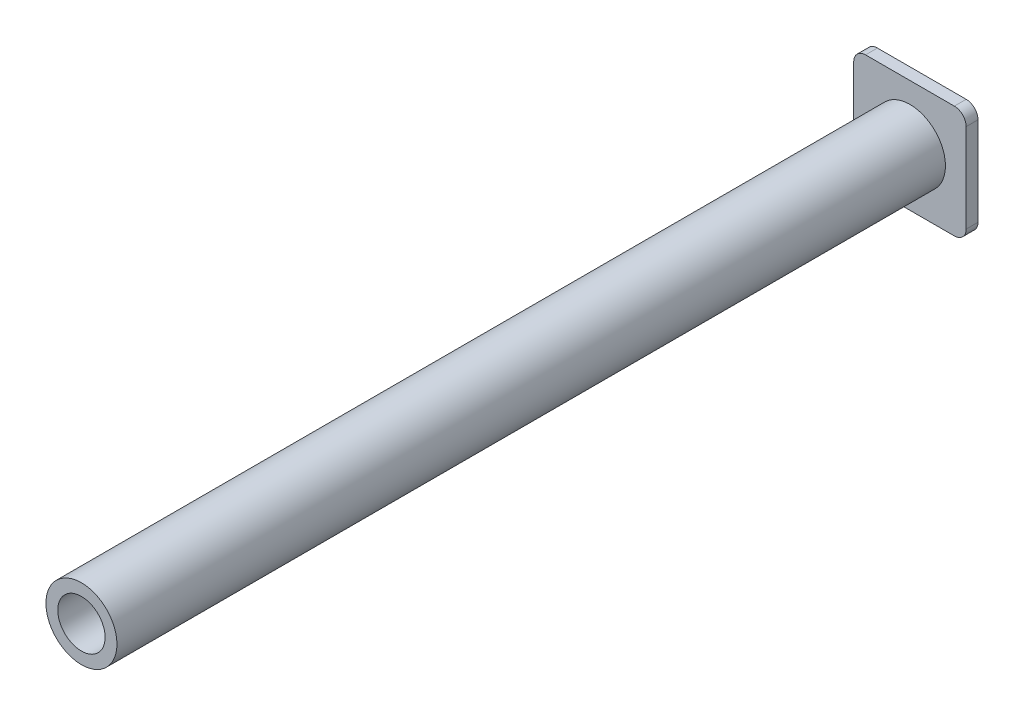
ISO-10303-21;
HEADER;
FILE_DESCRIPTION(('STEP AP214'),'2;1');
FILE_NAME('part.step','',(''),(''),'','','');
FILE_SCHEMA(('AUTOMOTIVE_DESIGN { 1 0 10303 214 1 1 1 1 }'));
ENDSEC;
DATA;
#1=APPLICATION_CONTEXT('core data for automotive mechanical design processes');
#2=APPLICATION_PROTOCOL_DEFINITION('international standard','automotive_design',2000,#1);
#3=PRODUCT_CONTEXT('',#1,'mechanical');
#4=PRODUCT('Part','Part','',(#3));
#5=PRODUCT_RELATED_PRODUCT_CATEGORY('part','',(#4));
#6=PRODUCT_DEFINITION_FORMATION('','',#4);
#7=PRODUCT_DEFINITION_CONTEXT('part definition',#1,'design');
#8=PRODUCT_DEFINITION('design','',#6,#7);
#9=PRODUCT_DEFINITION_SHAPE('','',#8);
#10=(LENGTH_UNIT() NAMED_UNIT(*) SI_UNIT(.MILLI.,.METRE.));
#11=(NAMED_UNIT(*) PLANE_ANGLE_UNIT() SI_UNIT($,.RADIAN.));
#12=(NAMED_UNIT(*) SI_UNIT($,.STERADIAN.) SOLID_ANGLE_UNIT());
#13=UNCERTAINTY_MEASURE_WITH_UNIT(LENGTH_MEASURE(1.E-05),#10,'distance_accuracy_value','');
#14=(GEOMETRIC_REPRESENTATION_CONTEXT(3) GLOBAL_UNCERTAINTY_ASSIGNED_CONTEXT((#13)) GLOBAL_UNIT_ASSIGNED_CONTEXT((#10,
#11,#12)) REPRESENTATION_CONTEXT('',''));
#15=CARTESIAN_POINT('',(0.,0.,0.));
#16=DIRECTION('',(0.,0.,1.));
#17=DIRECTION('',(1.,0.,0.));
#18=AXIS2_PLACEMENT_3D('',#15,#16,#17);
#19=CARTESIAN_POINT('',(47.5,47.5,10.));
#20=DIRECTION('',(-1.,0.,0.));
#21=DIRECTION('',(0.,-1.,0.));
#22=AXIS2_PLACEMENT_3D('',#19,#20,#21);
#23=PLANE('',#22);
#24=DIRECTION('',(0.,1.,0.));
#25=VECTOR('',#24,1.);
#26=CARTESIAN_POINT('',(47.5,47.5,10.));
#27=LINE('',#26,#25);
#28=CARTESIAN_POINT('',(47.5,-37.5,10.));
#29=VERTEX_POINT('',#28);
#30=CARTESIAN_POINT('',(47.5,37.5,10.));
#31=VERTEX_POINT('',#30);
#32=EDGE_CURVE('E120',#29,#31,#27,.T.);
#33=ORIENTED_EDGE('',*,*,#32,.F.);
#34=DIRECTION('',(0.,0.,-1.));
#35=VECTOR('',#34,1.);
#36=CARTESIAN_POINT('',(47.5,-37.5,10.));
#37=LINE('',#36,#35);
#38=CARTESIAN_POINT('',(47.5,-37.5,0.));
#39=VERTEX_POINT('',#38);
#40=EDGE_CURVE('E105',#29,#39,#37,.T.);
#41=ORIENTED_EDGE('',*,*,#40,.T.);
#42=DIRECTION('',(0.,1.,0.));
#43=VECTOR('',#42,1.);
#44=CARTESIAN_POINT('',(47.5,47.5,0.));
#45=LINE('',#44,#43);
#46=CARTESIAN_POINT('',(47.5,37.5,0.));
#47=VERTEX_POINT('',#46);
#48=EDGE_CURVE('E117',#39,#47,#45,.T.);
#49=ORIENTED_EDGE('',*,*,#48,.T.);
#50=DIRECTION('',(0.,0.,-1.));
#51=VECTOR('',#50,1.);
#52=CARTESIAN_POINT('',(47.5,37.5,10.));
#53=LINE('',#52,#51);
#54=EDGE_CURVE('E122',#47,#31,#53,.F.);
#55=ORIENTED_EDGE('',*,*,#54,.T.);
#56=EDGE_LOOP('',(#33,#41,#49,#55));
#57=FACE_BOUND('',#56,.T.);
#58=ADVANCED_FACE('F34',(#57),#23,.F.);
#59=CARTESIAN_POINT('',(-47.5,47.5,10.));
#60=DIRECTION('',(0.,-1.,0.));
#61=DIRECTION('',(0.,0.,-1.));
#62=AXIS2_PLACEMENT_3D('',#59,#60,#61);
#63=PLANE('',#62);
#64=DIRECTION('',(-1.,0.,0.));
#65=VECTOR('',#64,1.);
#66=CARTESIAN_POINT('',(-47.5,47.5,0.));
#67=LINE('',#66,#65);
#68=CARTESIAN_POINT('',(37.5,47.5,0.));
#69=VERTEX_POINT('',#68);
#70=CARTESIAN_POINT('',(-37.5,47.5,0.));
#71=VERTEX_POINT('',#70);
#72=EDGE_CURVE('E126',#69,#71,#67,.T.);
#73=ORIENTED_EDGE('',*,*,#72,.T.);
#74=DIRECTION('',(0.,0.,-1.));
#75=VECTOR('',#74,1.);
#76=CARTESIAN_POINT('',(-37.5,47.5,10.));
#77=LINE('',#76,#75);
#78=CARTESIAN_POINT('',(-37.5,47.5,10.));
#79=VERTEX_POINT('',#78);
#80=EDGE_CURVE('E42',#71,#79,#77,.F.);
#81=ORIENTED_EDGE('',*,*,#80,.T.);
#82=DIRECTION('',(-1.,0.,0.));
#83=VECTOR('',#82,1.);
#84=CARTESIAN_POINT('',(-47.5,47.5,10.));
#85=LINE('',#84,#83);
#86=CARTESIAN_POINT('',(37.5,47.5,10.));
#87=VERTEX_POINT('',#86);
#88=EDGE_CURVE('E167',#87,#79,#85,.T.);
#89=ORIENTED_EDGE('',*,*,#88,.F.);
#90=DIRECTION('',(0.,0.,-1.));
#91=VECTOR('',#90,1.);
#92=CARTESIAN_POINT('',(37.5,47.5,10.));
#93=LINE('',#92,#91);
#94=EDGE_CURVE('E161',#87,#69,#93,.T.);
#95=ORIENTED_EDGE('',*,*,#94,.T.);
#96=EDGE_LOOP('',(#73,#81,#89,#95));
#97=FACE_BOUND('',#96,.T.);
#98=ADVANCED_FACE('F166',(#97),#63,.F.);
#99=CARTESIAN_POINT('',(-47.5,47.5,10.));
#100=DIRECTION('',(1.,0.,0.));
#101=DIRECTION('',(0.,1.,0.));
#102=AXIS2_PLACEMENT_3D('',#99,#100,#101);
#103=PLANE('',#102);
#104=DIRECTION('',(0.,-1.,0.));
#105=VECTOR('',#104,1.);
#106=CARTESIAN_POINT('',(-47.5,47.5,0.));
#107=LINE('',#106,#105);
#108=CARTESIAN_POINT('',(-47.5,37.5,0.));
#109=VERTEX_POINT('',#108);
#110=CARTESIAN_POINT('',(-47.5,-37.5,0.));
#111=VERTEX_POINT('',#110);
#112=EDGE_CURVE('E130',#109,#111,#107,.T.);
#113=ORIENTED_EDGE('',*,*,#112,.T.);
#114=DIRECTION('',(0.,0.,-1.));
#115=VECTOR('',#114,1.);
#116=CARTESIAN_POINT('',(-47.5,-37.5,10.));
#117=LINE('',#116,#115);
#118=CARTESIAN_POINT('',(-47.5,-37.5,10.));
#119=VERTEX_POINT('',#118);
#120=EDGE_CURVE('E49',#111,#119,#117,.F.);
#121=ORIENTED_EDGE('',*,*,#120,.T.);
#122=DIRECTION('',(0.,-1.,0.));
#123=VECTOR('',#122,1.);
#124=CARTESIAN_POINT('',(-47.5,47.5,10.));
#125=LINE('',#124,#123);
#126=CARTESIAN_POINT('',(-47.5,37.5,10.));
#127=VERTEX_POINT('',#126);
#128=EDGE_CURVE('E173',#127,#119,#125,.T.);
#129=ORIENTED_EDGE('',*,*,#128,.F.);
#130=DIRECTION('',(0.,0.,-1.));
#131=VECTOR('',#130,1.);
#132=CARTESIAN_POINT('',(-47.5,37.5,10.));
#133=LINE('',#132,#131);
#134=EDGE_CURVE('E157',#127,#109,#133,.T.);
#135=ORIENTED_EDGE('',*,*,#134,.T.);
#136=EDGE_LOOP('',(#113,#121,#129,#135));
#137=FACE_BOUND('',#136,.T.);
#138=ADVANCED_FACE('F178',(#137),#103,.F.);
#139=CARTESIAN_POINT('',(-47.5,-47.5,10.));
#140=DIRECTION('',(0.,1.,0.));
#141=DIRECTION('',(0.,0.,1.));
#142=AXIS2_PLACEMENT_3D('',#139,#140,#141);
#143=PLANE('',#142);
#144=DIRECTION('',(1.,0.,0.));
#145=VECTOR('',#144,1.);
#146=CARTESIAN_POINT('',(-47.5,-47.5,0.));
#147=LINE('',#146,#145);
#148=CARTESIAN_POINT('',(-37.5,-47.5,0.));
#149=VERTEX_POINT('',#148);
#150=CARTESIAN_POINT('',(37.5,-47.5,0.));
#151=VERTEX_POINT('',#150);
#152=EDGE_CURVE('E140',#149,#151,#147,.T.);
#153=ORIENTED_EDGE('',*,*,#152,.T.);
#154=DIRECTION('',(0.,0.,-1.));
#155=VECTOR('',#154,1.);
#156=CARTESIAN_POINT('',(37.5,-47.5,10.));
#157=LINE('',#156,#155);
#158=CARTESIAN_POINT('',(37.5,-47.5,10.));
#159=VERTEX_POINT('',#158);
#160=EDGE_CURVE('E106',#151,#159,#157,.F.);
#161=ORIENTED_EDGE('',*,*,#160,.T.);
#162=DIRECTION('',(1.,0.,0.));
#163=VECTOR('',#162,1.);
#164=CARTESIAN_POINT('',(-47.5,-47.5,10.));
#165=LINE('',#164,#163);
#166=CARTESIAN_POINT('',(-37.5,-47.5,10.));
#167=VERTEX_POINT('',#166);
#168=EDGE_CURVE('E136',#167,#159,#165,.T.);
#169=ORIENTED_EDGE('',*,*,#168,.F.);
#170=DIRECTION('',(0.,0.,-1.));
#171=VECTOR('',#170,1.);
#172=CARTESIAN_POINT('',(-37.5,-47.5,10.));
#173=LINE('',#172,#171);
#174=EDGE_CURVE('E111',#167,#149,#173,.T.);
#175=ORIENTED_EDGE('',*,*,#174,.T.);
#176=EDGE_LOOP('',(#153,#161,#169,#175));
#177=FACE_BOUND('',#176,.T.);
#178=ADVANCED_FACE('F185',(#177),#143,.F.);
#179=CARTESIAN_POINT('',(0.,0.,10.));
#180=DIRECTION('',(0.,0.,1.));
#181=DIRECTION('',(1.,0.,0.));
#182=AXIS2_PLACEMENT_3D('',#179,#180,#181);
#183=PLANE('',#182);
#184=CARTESIAN_POINT('',(0.,0.,10.));
#185=DIRECTION('',(0.,0.,1.));
#186=DIRECTION('',(1.,0.,0.));
#187=AXIS2_PLACEMENT_3D('',#184,#185,#186);
#188=CIRCLE('',#187,30.);
#189=CARTESIAN_POINT('',(30.,0.,10.));
#190=VERTEX_POINT('',#189);
#191=EDGE_CURVE('E133',#190,#190,#188,.T.);
#192=ORIENTED_EDGE('',*,*,#191,.F.);
#193=EDGE_LOOP('',(#192));
#194=FACE_BOUND('',#193,.T.);
#195=ORIENTED_EDGE('',*,*,#168,.T.);
#196=CARTESIAN_POINT('',(37.5,-37.5,10.));
#197=DIRECTION('',(0.,0.,1.));
#198=DIRECTION('',(1.,0.,0.));
#199=AXIS2_PLACEMENT_3D('',#196,#197,#198);
#200=CIRCLE('',#199,10.);
#201=EDGE_CURVE('E155',#159,#29,#200,.T.);
#202=ORIENTED_EDGE('',*,*,#201,.T.);
#203=ORIENTED_EDGE('',*,*,#32,.T.);
#204=CARTESIAN_POINT('',(37.5,37.5,10.));
#205=DIRECTION('',(0.,0.,1.));
#206=DIRECTION('',(1.,0.,0.));
#207=AXIS2_PLACEMENT_3D('',#204,#205,#206);
#208=CIRCLE('',#207,10.);
#209=EDGE_CURVE('E150',#31,#87,#208,.T.);
#210=ORIENTED_EDGE('',*,*,#209,.T.);
#211=ORIENTED_EDGE('',*,*,#88,.T.);
#212=CARTESIAN_POINT('',(-37.5,37.5,10.));
#213=DIRECTION('',(0.,0.,1.));
#214=DIRECTION('',(1.,0.,0.));
#215=AXIS2_PLACEMENT_3D('',#212,#213,#214);
#216=CIRCLE('',#215,10.);
#217=EDGE_CURVE('E56',#79,#127,#216,.T.);
#218=ORIENTED_EDGE('',*,*,#217,.T.);
#219=ORIENTED_EDGE('',*,*,#128,.T.);
#220=CARTESIAN_POINT('',(-37.5,-37.5,10.));
#221=DIRECTION('',(0.,0.,1.));
#222=DIRECTION('',(1.,0.,0.));
#223=AXIS2_PLACEMENT_3D('',#220,#221,#222);
#224=CIRCLE('',#223,10.);
#225=EDGE_CURVE('E153',#119,#167,#224,.T.);
#226=ORIENTED_EDGE('',*,*,#225,.T.);
#227=EDGE_LOOP('',(#195,#202,#203,#210,#211,#218,#219,#226));
#228=FACE_BOUND('',#227,.T.);
#229=ADVANCED_FACE('F171',(#194,#228),#183,.T.);
#230=CARTESIAN_POINT('',(0.,0.,0.));
#231=DIRECTION('',(0.,0.,1.));
#232=DIRECTION('',(1.,0.,0.));
#233=AXIS2_PLACEMENT_3D('',#230,#231,#232);
#234=PLANE('',#233);
#235=ORIENTED_EDGE('',*,*,#48,.F.);
#236=CARTESIAN_POINT('',(37.5,-37.5,0.));
#237=DIRECTION('',(0.,0.,1.));
#238=DIRECTION('',(1.,0.,0.));
#239=AXIS2_PLACEMENT_3D('',#236,#237,#238);
#240=CIRCLE('',#239,10.);
#241=EDGE_CURVE('E101',#39,#151,#240,.F.);
#242=ORIENTED_EDGE('',*,*,#241,.T.);
#243=ORIENTED_EDGE('',*,*,#152,.F.);
#244=CARTESIAN_POINT('',(-37.5,-37.5,0.));
#245=DIRECTION('',(0.,0.,1.));
#246=DIRECTION('',(1.,0.,0.));
#247=AXIS2_PLACEMENT_3D('',#244,#245,#246);
#248=CIRCLE('',#247,10.);
#249=EDGE_CURVE('E112',#149,#111,#248,.F.);
#250=ORIENTED_EDGE('',*,*,#249,.T.);
#251=ORIENTED_EDGE('',*,*,#112,.F.);
#252=CARTESIAN_POINT('',(-37.5,37.5,0.));
#253=DIRECTION('',(0.,0.,1.));
#254=DIRECTION('',(1.,0.,0.));
#255=AXIS2_PLACEMENT_3D('',#252,#253,#254);
#256=CIRCLE('',#255,10.);
#257=EDGE_CURVE('E144',#109,#71,#256,.F.);
#258=ORIENTED_EDGE('',*,*,#257,.T.);
#259=ORIENTED_EDGE('',*,*,#72,.F.);
#260=CARTESIAN_POINT('',(37.5,37.5,0.));
#261=DIRECTION('',(0.,0.,1.));
#262=DIRECTION('',(1.,0.,0.));
#263=AXIS2_PLACEMENT_3D('',#260,#261,#262);
#264=CIRCLE('',#263,10.);
#265=EDGE_CURVE('E121',#69,#47,#264,.F.);
#266=ORIENTED_EDGE('',*,*,#265,.T.);
#267=EDGE_LOOP('',(#235,#242,#243,#250,#251,#258,#259,#266));
#268=FACE_BOUND('',#267,.T.);
#269=ADVANCED_FACE('F124',(#268),#234,.F.);
#270=CARTESIAN_POINT('',(37.5,-37.5,10.));
#271=DIRECTION('',(0.,0.,-1.));
#272=DIRECTION('',(-1.,0.,0.));
#273=AXIS2_PLACEMENT_3D('',#270,#271,#272);
#274=CYLINDRICAL_SURFACE('',#273,10.);
#275=ORIENTED_EDGE('',*,*,#201,.F.);
#276=ORIENTED_EDGE('',*,*,#160,.F.);
#277=ORIENTED_EDGE('',*,*,#241,.F.);
#278=ORIENTED_EDGE('',*,*,#40,.F.);
#279=EDGE_LOOP('',(#275,#276,#277,#278));
#280=FACE_BOUND('',#279,.T.);
#281=ADVANCED_FACE('F104',(#280),#274,.T.);
#282=CARTESIAN_POINT('',(-37.5,-37.5,10.));
#283=DIRECTION('',(0.,0.,-1.));
#284=DIRECTION('',(-1.,0.,0.));
#285=AXIS2_PLACEMENT_3D('',#282,#283,#284);
#286=CYLINDRICAL_SURFACE('',#285,10.);
#287=ORIENTED_EDGE('',*,*,#225,.F.);
#288=ORIENTED_EDGE('',*,*,#120,.F.);
#289=ORIENTED_EDGE('',*,*,#249,.F.);
#290=ORIENTED_EDGE('',*,*,#174,.F.);
#291=EDGE_LOOP('',(#287,#288,#289,#290));
#292=FACE_BOUND('',#291,.T.);
#293=ADVANCED_FACE('F182',(#292),#286,.T.);
#294=CARTESIAN_POINT('',(-37.5,37.5,10.));
#295=DIRECTION('',(0.,0.,-1.));
#296=DIRECTION('',(-1.,0.,0.));
#297=AXIS2_PLACEMENT_3D('',#294,#295,#296);
#298=CYLINDRICAL_SURFACE('',#297,10.);
#299=ORIENTED_EDGE('',*,*,#217,.F.);
#300=ORIENTED_EDGE('',*,*,#80,.F.);
#301=ORIENTED_EDGE('',*,*,#257,.F.);
#302=ORIENTED_EDGE('',*,*,#134,.F.);
#303=EDGE_LOOP('',(#299,#300,#301,#302));
#304=FACE_BOUND('',#303,.T.);
#305=ADVANCED_FACE('F176',(#304),#298,.T.);
#306=CARTESIAN_POINT('',(37.5,37.5,10.));
#307=DIRECTION('',(0.,0.,-1.));
#308=DIRECTION('',(-1.,0.,0.));
#309=AXIS2_PLACEMENT_3D('',#306,#307,#308);
#310=CYLINDRICAL_SURFACE('',#309,10.);
#311=ORIENTED_EDGE('',*,*,#209,.F.);
#312=ORIENTED_EDGE('',*,*,#54,.F.);
#313=ORIENTED_EDGE('',*,*,#265,.F.);
#314=ORIENTED_EDGE('',*,*,#94,.F.);
#315=EDGE_LOOP('',(#311,#312,#313,#314));
#316=FACE_BOUND('',#315,.T.);
#317=ADVANCED_FACE('F36',(#316),#310,.T.);
#318=CARTESIAN_POINT('',(0.,0.,710.));
#319=DIRECTION('',(0.,0.,1.));
#320=DIRECTION('',(1.,0.,0.));
#321=AXIS2_PLACEMENT_3D('',#318,#319,#320);
#322=PLANE('',#321);
#323=CARTESIAN_POINT('',(0.,0.,710.));
#324=DIRECTION('',(0.,0.,1.));
#325=DIRECTION('',(1.,0.,0.));
#326=AXIS2_PLACEMENT_3D('',#323,#324,#325);
#327=CIRCLE('',#326,30.);
#328=CARTESIAN_POINT('',(30.,0.,710.));
#329=VERTEX_POINT('',#328);
#330=EDGE_CURVE('E127',#329,#329,#327,.T.);
#331=ORIENTED_EDGE('',*,*,#330,.T.);
#332=EDGE_LOOP('',(#331));
#333=FACE_BOUND('',#332,.T.);
#334=CARTESIAN_POINT('',(0.,0.,710.));
#335=DIRECTION('',(0.,0.,1.));
#336=DIRECTION('',(1.,0.,0.));
#337=AXIS2_PLACEMENT_3D('',#334,#335,#336);
#338=CIRCLE('',#337,20.);
#339=CARTESIAN_POINT('',(20.,0.,710.));
#340=VERTEX_POINT('',#339);
#341=EDGE_CURVE('E189',#340,#340,#338,.T.);
#342=ORIENTED_EDGE('',*,*,#341,.F.);
#343=EDGE_LOOP('',(#342));
#344=FACE_BOUND('',#343,.T.);
#345=ADVANCED_FACE('F197',(#333,#344),#322,.T.);
#346=CARTESIAN_POINT('',(0.,0.,710.));
#347=DIRECTION('',(0.,0.,-1.));
#348=DIRECTION('',(-1.,0.,0.));
#349=AXIS2_PLACEMENT_3D('',#346,#347,#348);
#350=CYLINDRICAL_SURFACE('',#349,30.);
#351=ORIENTED_EDGE('',*,*,#330,.F.);
#352=EDGE_LOOP('',(#351));
#353=FACE_BOUND('',#352,.T.);
#354=ORIENTED_EDGE('',*,*,#191,.T.);
#355=EDGE_LOOP('',(#354));
#356=FACE_BOUND('',#355,.T.);
#357=ADVANCED_FACE('F199',(#353,#356),#350,.T.);
#358=CARTESIAN_POINT('',(0.,0.,710.));
#359=DIRECTION('',(0.,0.,-1.));
#360=DIRECTION('',(-1.,0.,0.));
#361=AXIS2_PLACEMENT_3D('',#358,#359,#360);
#362=CYLINDRICAL_SURFACE('',#361,20.);
#363=ORIENTED_EDGE('',*,*,#341,.T.);
#364=EDGE_LOOP('',(#363));
#365=FACE_BOUND('',#364,.T.);
#366=CARTESIAN_POINT('',(0.,0.,10.));
#367=DIRECTION('',(0.,0.,1.));
#368=DIRECTION('',(1.,0.,0.));
#369=AXIS2_PLACEMENT_3D('',#366,#367,#368);
#370=CIRCLE('',#369,20.);
#371=CARTESIAN_POINT('',(20.,0.,10.));
#372=VERTEX_POINT('',#371);
#373=EDGE_CURVE('E11',#372,#372,#370,.F.);
#374=ORIENTED_EDGE('',*,*,#373,.T.);
#375=EDGE_LOOP('',(#374));
#376=FACE_BOUND('',#375,.T.);
#377=ADVANCED_FACE('F194',(#365,#376),#362,.F.);
#378=ORIENTED_EDGE('',*,*,#373,.F.);
#379=EDGE_LOOP('',(#378));
#380=FACE_BOUND('',#379,.T.);
#381=ADVANCED_FACE('F241',(#380),#183,.T.);
#382=CLOSED_SHELL('',(#58,#98,#138,#178,#229,#269,#281,#293,#305,#317,#345,#357,#377,#381));
#383=MANIFOLD_SOLID_BREP('B2',#382);
#384=ADVANCED_BREP_SHAPE_REPRESENTATION('',(#18,#383),#14);
#385=SHAPE_DEFINITION_REPRESENTATION(#9,#384);
ENDSEC;
END-ISO-10303-21;
